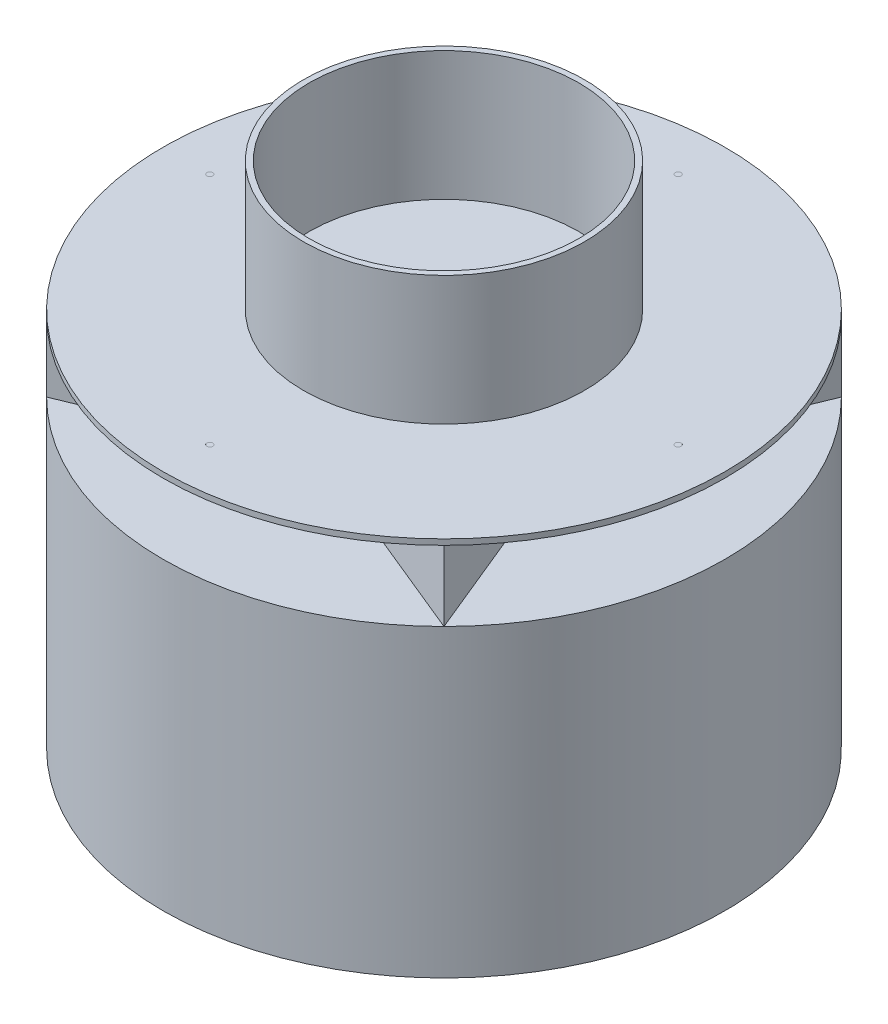
ISO-10303-21;
HEADER;
FILE_DESCRIPTION(('STEP AP214'),'2;1');
FILE_NAME('part.step','',(''),(''),'','','');
FILE_SCHEMA(('AUTOMOTIVE_DESIGN { 1 0 10303 214 1 1 1 1 }'));
ENDSEC;
DATA;
#1=APPLICATION_CONTEXT('core data for automotive mechanical design processes');
#2=APPLICATION_PROTOCOL_DEFINITION('international standard','automotive_design',2000,#1);
#3=PRODUCT_CONTEXT('',#1,'mechanical');
#4=PRODUCT('Part','Part','',(#3));
#5=PRODUCT_RELATED_PRODUCT_CATEGORY('part','',(#4));
#6=PRODUCT_DEFINITION_FORMATION('','',#4);
#7=PRODUCT_DEFINITION_CONTEXT('part definition',#1,'design');
#8=PRODUCT_DEFINITION('design','',#6,#7);
#9=PRODUCT_DEFINITION_SHAPE('','',#8);
#10=(LENGTH_UNIT() NAMED_UNIT(*) SI_UNIT(.MILLI.,.METRE.));
#11=(NAMED_UNIT(*) PLANE_ANGLE_UNIT() SI_UNIT($,.RADIAN.));
#12=(NAMED_UNIT(*) SI_UNIT($,.STERADIAN.) SOLID_ANGLE_UNIT());
#13=UNCERTAINTY_MEASURE_WITH_UNIT(LENGTH_MEASURE(1.E-05),#10,'distance_accuracy_value','');
#14=(GEOMETRIC_REPRESENTATION_CONTEXT(3) GLOBAL_UNCERTAINTY_ASSIGNED_CONTEXT((#13)) GLOBAL_UNIT_ASSIGNED_CONTEXT((#10,
#11,#12)) REPRESENTATION_CONTEXT('',''));
#15=CARTESIAN_POINT('',(0.,0.,0.));
#16=DIRECTION('',(0.,0.,1.));
#17=DIRECTION('',(1.,0.,0.));
#18=AXIS2_PLACEMENT_3D('',#15,#16,#17);
#19=CARTESIAN_POINT('',(0.,330.2,0.));
#20=DIRECTION('',(0.,1.,0.));
#21=DIRECTION('',(0.,0.,1.));
#22=AXIS2_PLACEMENT_3D('',#19,#20,#21);
#23=PLANE('',#22);
#24=CARTESIAN_POINT('',(0.,330.2,0.));
#25=DIRECTION('',(0.,1.,0.));
#26=DIRECTION('',(0.,0.,1.));
#27=AXIS2_PLACEMENT_3D('',#24,#25,#26);
#28=CIRCLE('',#27,304.799999999999);
#29=CARTESIAN_POINT('',(215.526146905657,330.2,215.526146905661));
#30=VERTEX_POINT('',#29);
#31=CARTESIAN_POINT('',(215.526146905657,330.2,-215.526146905661));
#32=VERTEX_POINT('',#31);
#33=EDGE_CURVE('E77',#30,#32,#28,.T.);
#34=ORIENTED_EDGE('',*,*,#33,.T.);
#35=DIRECTION('',(-0.379942648819439,0.,0.925010045139007));
#36=VECTOR('',#35,1.);
#37=CARTESIAN_POINT('',(108.666735118225,330.2,44.6342473753073));
#38=LINE('',#37,#36);
#39=CARTESIAN_POINT('',(127.,330.2,0.));
#40=VERTEX_POINT('',#39);
#41=EDGE_CURVE('E84',#32,#40,#38,.T.);
#42=ORIENTED_EDGE('',*,*,#41,.T.);
#43=DIRECTION('',(0.379942648819439,0.,0.925010045139007));
#44=VECTOR('',#43,1.);
#45=CARTESIAN_POINT('',(127.,330.2,0.));
#46=LINE('',#45,#44);
#47=EDGE_CURVE('E198',#40,#30,#46,.T.);
#48=ORIENTED_EDGE('',*,*,#47,.T.);
#49=EDGE_LOOP('',(#34,#42,#48));
#50=FACE_BOUND('',#49,.T.);
#51=ADVANCED_FACE('F69',(#50),#23,.T.);
#52=DIRECTION('',(0.925010045138999,0.,0.379942648819459));
#53=VECTOR('',#52,1.);
#54=CARTESIAN_POINT('',(0.,330.2,127.));
#55=LINE('',#54,#53);
#56=CARTESIAN_POINT('',(0.,330.2,127.));
#57=VERTEX_POINT('',#56);
#58=EDGE_CURVE('E177',#57,#30,#55,.T.);
#59=ORIENTED_EDGE('',*,*,#58,.F.);
#60=DIRECTION('',(0.925010045138999,0.,-0.379942648819459));
#61=VECTOR('',#60,1.);
#62=CARTESIAN_POINT('',(-215.526146905657,330.2,215.526146905661));
#63=LINE('',#62,#61);
#64=CARTESIAN_POINT('',(-215.526146905657,330.2,215.526146905661));
#65=VERTEX_POINT('',#64);
#66=EDGE_CURVE('E201',#65,#57,#63,.T.);
#67=ORIENTED_EDGE('',*,*,#66,.F.);
#68=EDGE_CURVE('E212',#65,#30,#28,.T.);
#69=ORIENTED_EDGE('',*,*,#68,.T.);
#70=EDGE_LOOP('',(#59,#67,#69));
#71=FACE_BOUND('',#70,.T.);
#72=ADVANCED_FACE('F304',(#71),#23,.T.);
#73=DIRECTION('',(-0.379942648819439,0.,0.925010045139007));
#74=VECTOR('',#73,1.);
#75=CARTESIAN_POINT('',(-127.,330.2,0.));
#76=LINE('',#75,#74);
#77=CARTESIAN_POINT('',(-127.,330.2,0.));
#78=VERTEX_POINT('',#77);
#79=EDGE_CURVE('E203',#78,#65,#76,.T.);
#80=ORIENTED_EDGE('',*,*,#79,.F.);
#81=DIRECTION('',(-0.379942648819439,0.,-0.925010045139007));
#82=VECTOR('',#81,1.);
#83=CARTESIAN_POINT('',(-127.,330.2,0.));
#84=LINE('',#83,#82);
#85=CARTESIAN_POINT('',(-215.526146905657,330.2,-215.526146905661));
#86=VERTEX_POINT('',#85);
#87=EDGE_CURVE('E186',#78,#86,#84,.T.);
#88=ORIENTED_EDGE('',*,*,#87,.T.);
#89=EDGE_CURVE('E218',#86,#65,#28,.T.);
#90=ORIENTED_EDGE('',*,*,#89,.T.);
#91=EDGE_LOOP('',(#80,#88,#90));
#92=FACE_BOUND('',#91,.T.);
#93=ADVANCED_FACE('F311',(#92),#23,.T.);
#94=CARTESIAN_POINT('',(0.,330.2,0.));
#95=DIRECTION('',(0.,-1.,0.));
#96=DIRECTION('',(0.,0.,-1.));
#97=AXIS2_PLACEMENT_3D('',#94,#95,#96);
#98=CYLINDRICAL_SURFACE('',#97,304.799999999999);
#99=ORIENTED_EDGE('',*,*,#33,.F.);
#100=ORIENTED_EDGE('',*,*,#68,.F.);
#101=ORIENTED_EDGE('',*,*,#89,.F.);
#102=EDGE_CURVE('E211',#32,#86,#28,.T.);
#103=ORIENTED_EDGE('',*,*,#102,.F.);
#104=EDGE_LOOP('',(#99,#100,#101,#103));
#105=FACE_BOUND('',#104,.T.);
#106=CARTESIAN_POINT('',(0.,0.,0.));
#107=DIRECTION('',(0.,1.,0.));
#108=DIRECTION('',(0.,0.,1.));
#109=AXIS2_PLACEMENT_3D('',#106,#107,#108);
#110=CIRCLE('',#109,304.799999999999);
#111=CARTESIAN_POINT('',(0.,0.,304.799999999999));
#112=VERTEX_POINT('',#111);
#113=EDGE_CURVE('E213',#112,#112,#110,.T.);
#114=ORIENTED_EDGE('',*,*,#113,.T.);
#115=EDGE_LOOP('',(#114));
#116=FACE_BOUND('',#115,.T.);
#117=ADVANCED_FACE('F71',(#105,#116),#98,.T.);
#118=DIRECTION('',(-0.925010045138999,0.,-0.379942648819459));
#119=VECTOR('',#118,1.);
#120=CARTESIAN_POINT('',(0.,330.2,-127.));
#121=LINE('',#120,#119);
#122=CARTESIAN_POINT('',(0.,330.2,-127.));
#123=VERTEX_POINT('',#122);
#124=EDGE_CURVE('E184',#123,#86,#121,.T.);
#125=ORIENTED_EDGE('',*,*,#124,.F.);
#126=DIRECTION('',(0.925010045138999,0.,-0.379942648819459));
#127=VECTOR('',#126,1.);
#128=CARTESIAN_POINT('',(-44.6342473753093,330.2,-108.666735118223));
#129=LINE('',#128,#127);
#130=EDGE_CURVE('E229',#123,#32,#129,.T.);
#131=ORIENTED_EDGE('',*,*,#130,.T.);
#132=ORIENTED_EDGE('',*,*,#102,.T.);
#133=EDGE_LOOP('',(#125,#131,#132));
#134=FACE_BOUND('',#133,.T.);
#135=ADVANCED_FACE('F307',(#134),#23,.T.);
#136=CARTESIAN_POINT('',(0.,0.,0.));
#137=DIRECTION('',(0.,1.,0.));
#138=DIRECTION('',(0.,0.,1.));
#139=AXIS2_PLACEMENT_3D('',#136,#137,#138);
#140=PLANE('',#139);
#141=ORIENTED_EDGE('',*,*,#113,.F.);
#142=EDGE_LOOP('',(#141));
#143=FACE_BOUND('',#142,.T.);
#144=ADVANCED_FACE('F315',(#143),#140,.F.);
#145=CARTESIAN_POINT('',(108.666735118225,406.4,44.6342473753073));
#146=DIRECTION('',(0.925010045139007,0.,0.379942648819439));
#147=DIRECTION('',(0.379942648819439,0.,-0.925010045139007));
#148=AXIS2_PLACEMENT_3D('',#145,#146,#147);
#149=PLANE('',#148);
#150=ORIENTED_EDGE('',*,*,#41,.F.);
#151=DIRECTION('',(0.,-1.,0.));
#152=VECTOR('',#151,1.);
#153=CARTESIAN_POINT('',(215.526146905657,406.4,-215.526146905661));
#154=LINE('',#153,#152);
#155=CARTESIAN_POINT('',(215.526146905657,406.4,-215.526146905661));
#156=VERTEX_POINT('',#155);
#157=EDGE_CURVE('E222',#156,#32,#154,.T.);
#158=ORIENTED_EDGE('',*,*,#157,.F.);
#159=DIRECTION('',(-0.379942648819439,0.,0.925010045139007));
#160=VECTOR('',#159,1.);
#161=CARTESIAN_POINT('',(108.666735118225,406.4,44.6342473753073));
#162=LINE('',#161,#160);
#163=CARTESIAN_POINT('',(127.,406.4,0.));
#164=VERTEX_POINT('',#163);
#165=EDGE_CURVE('E170',#156,#164,#162,.T.);
#166=ORIENTED_EDGE('',*,*,#165,.T.);
#167=DIRECTION('',(0.,-1.,0.));
#168=VECTOR('',#167,1.);
#169=CARTESIAN_POINT('',(127.,406.4,0.));
#170=LINE('',#169,#168);
#171=EDGE_CURVE('E119',#164,#40,#170,.T.);
#172=ORIENTED_EDGE('',*,*,#171,.T.);
#173=EDGE_LOOP('',(#150,#158,#166,#172));
#174=FACE_BOUND('',#173,.T.);
#175=ADVANCED_FACE('F321',(#174),#149,.T.);
#176=CARTESIAN_POINT('',(-44.6342473753093,406.4,-108.666735118223));
#177=DIRECTION('',(-0.379942648819459,0.,-0.925010045138999));
#178=DIRECTION('',(-0.925010045138999,0.,0.379942648819459));
#179=AXIS2_PLACEMENT_3D('',#176,#177,#178);
#180=PLANE('',#179);
#181=ORIENTED_EDGE('',*,*,#130,.F.);
#182=DIRECTION('',(0.,-1.,0.));
#183=VECTOR('',#182,1.);
#184=CARTESIAN_POINT('',(0.,406.4,-127.));
#185=LINE('',#184,#183);
#186=CARTESIAN_POINT('',(0.,406.4,-127.));
#187=VERTEX_POINT('',#186);
#188=EDGE_CURVE('E226',#187,#123,#185,.T.);
#189=ORIENTED_EDGE('',*,*,#188,.F.);
#190=DIRECTION('',(0.925010045138999,0.,-0.379942648819459));
#191=VECTOR('',#190,1.);
#192=CARTESIAN_POINT('',(-44.6342473753093,406.4,-108.666735118223));
#193=LINE('',#192,#191);
#194=EDGE_CURVE('E228',#187,#156,#193,.T.);
#195=ORIENTED_EDGE('',*,*,#194,.T.);
#196=ORIENTED_EDGE('',*,*,#157,.T.);
#197=EDGE_LOOP('',(#181,#189,#195,#196));
#198=FACE_BOUND('',#197,.T.);
#199=ADVANCED_FACE('F343',(#198),#180,.T.);
#200=CARTESIAN_POINT('',(-127.,406.4,0.));
#201=DIRECTION('',(-0.925010045139007,0.,0.379942648819439));
#202=DIRECTION('',(0.379942648819439,0.,0.925010045139007));
#203=AXIS2_PLACEMENT_3D('',#200,#201,#202);
#204=PLANE('',#203);
#205=ORIENTED_EDGE('',*,*,#87,.F.);
#206=DIRECTION('',(0.,-1.,0.));
#207=VECTOR('',#206,1.);
#208=CARTESIAN_POINT('',(-127.,406.4,0.));
#209=LINE('',#208,#207);
#210=CARTESIAN_POINT('',(-127.,406.4,0.));
#211=VERTEX_POINT('',#210);
#212=EDGE_CURVE('E189',#211,#78,#209,.T.);
#213=ORIENTED_EDGE('',*,*,#212,.F.);
#214=DIRECTION('',(-0.379942648819439,0.,-0.925010045139007));
#215=VECTOR('',#214,1.);
#216=CARTESIAN_POINT('',(-127.,406.4,0.));
#217=LINE('',#216,#215);
#218=CARTESIAN_POINT('',(-215.526146905657,406.4,-215.526146905661));
#219=VERTEX_POINT('',#218);
#220=EDGE_CURVE('E195',#211,#219,#217,.T.);
#221=ORIENTED_EDGE('',*,*,#220,.T.);
#222=DIRECTION('',(0.,-1.,0.));
#223=VECTOR('',#222,1.);
#224=CARTESIAN_POINT('',(-215.526146905657,406.4,-215.526146905661));
#225=LINE('',#224,#223);
#226=EDGE_CURVE('E113',#219,#86,#225,.T.);
#227=ORIENTED_EDGE('',*,*,#226,.T.);
#228=EDGE_LOOP('',(#205,#213,#221,#227));
#229=FACE_BOUND('',#228,.T.);
#230=ADVANCED_FACE('F350',(#229),#204,.T.);
#231=CARTESIAN_POINT('',(0.,406.4,-127.));
#232=DIRECTION('',(-0.379942648819459,0.,0.925010045138999));
#233=DIRECTION('',(0.925010045138999,0.,0.379942648819459));
#234=AXIS2_PLACEMENT_3D('',#231,#232,#233);
#235=PLANE('',#234);
#236=ORIENTED_EDGE('',*,*,#124,.T.);
#237=ORIENTED_EDGE('',*,*,#226,.F.);
#238=DIRECTION('',(-0.925010045138999,0.,-0.379942648819459));
#239=VECTOR('',#238,1.);
#240=CARTESIAN_POINT('',(0.,406.4,-127.));
#241=LINE('',#240,#239);
#242=EDGE_CURVE('E181',#187,#219,#241,.T.);
#243=ORIENTED_EDGE('',*,*,#242,.F.);
#244=ORIENTED_EDGE('',*,*,#188,.T.);
#245=EDGE_LOOP('',(#236,#237,#243,#244));
#246=FACE_BOUND('',#245,.T.);
#247=ADVANCED_FACE('F352',(#246),#235,.F.);
#248=CARTESIAN_POINT('',(0.,406.4,127.));
#249=DIRECTION('',(0.379942648819459,0.,-0.925010045138999));
#250=DIRECTION('',(-0.925010045138999,0.,-0.379942648819459));
#251=AXIS2_PLACEMENT_3D('',#248,#249,#250);
#252=PLANE('',#251);
#253=ORIENTED_EDGE('',*,*,#58,.T.);
#254=DIRECTION('',(0.,-1.,0.));
#255=VECTOR('',#254,1.);
#256=CARTESIAN_POINT('',(215.526146905657,406.4,215.526146905661));
#257=LINE('',#256,#255);
#258=CARTESIAN_POINT('',(215.526146905657,406.4,215.526146905661));
#259=VERTEX_POINT('',#258);
#260=EDGE_CURVE('E174',#259,#30,#257,.T.);
#261=ORIENTED_EDGE('',*,*,#260,.F.);
#262=DIRECTION('',(0.925010045138999,0.,0.379942648819459));
#263=VECTOR('',#262,1.);
#264=CARTESIAN_POINT('',(0.,406.4,127.));
#265=LINE('',#264,#263);
#266=CARTESIAN_POINT('',(0.,406.4,127.));
#267=VERTEX_POINT('',#266);
#268=EDGE_CURVE('E146',#267,#259,#265,.T.);
#269=ORIENTED_EDGE('',*,*,#268,.F.);
#270=DIRECTION('',(0.,-1.,0.));
#271=VECTOR('',#270,1.);
#272=CARTESIAN_POINT('',(0.,406.4,127.));
#273=LINE('',#272,#271);
#274=EDGE_CURVE('E93',#267,#57,#273,.T.);
#275=ORIENTED_EDGE('',*,*,#274,.T.);
#276=EDGE_LOOP('',(#253,#261,#269,#275));
#277=FACE_BOUND('',#276,.T.);
#278=ADVANCED_FACE('F175',(#277),#252,.F.);
#279=CARTESIAN_POINT('',(127.,406.4,0.));
#280=DIRECTION('',(0.925010045139007,0.,-0.379942648819439));
#281=DIRECTION('',(-0.379942648819439,0.,-0.925010045139007));
#282=AXIS2_PLACEMENT_3D('',#279,#280,#281);
#283=PLANE('',#282);
#284=ORIENTED_EDGE('',*,*,#47,.F.);
#285=ORIENTED_EDGE('',*,*,#171,.F.);
#286=DIRECTION('',(0.379942648819439,0.,0.925010045139007));
#287=VECTOR('',#286,1.);
#288=CARTESIAN_POINT('',(127.,406.4,0.));
#289=LINE('',#288,#287);
#290=EDGE_CURVE('E154',#164,#259,#289,.T.);
#291=ORIENTED_EDGE('',*,*,#290,.T.);
#292=ORIENTED_EDGE('',*,*,#260,.T.);
#293=EDGE_LOOP('',(#284,#285,#291,#292));
#294=FACE_BOUND('',#293,.T.);
#295=ADVANCED_FACE('F183',(#294),#283,.T.);
#296=CARTESIAN_POINT('',(-127.,406.4,0.));
#297=DIRECTION('',(0.925010045139007,0.,0.379942648819439));
#298=DIRECTION('',(0.379942648819439,0.,-0.925010045139007));
#299=AXIS2_PLACEMENT_3D('',#296,#297,#298);
#300=PLANE('',#299);
#301=ORIENTED_EDGE('',*,*,#79,.T.);
#302=DIRECTION('',(0.,-1.,0.));
#303=VECTOR('',#302,1.);
#304=CARTESIAN_POINT('',(-215.526146905657,406.4,215.526146905661));
#305=LINE('',#304,#303);
#306=CARTESIAN_POINT('',(-215.526146905657,406.4,215.526146905661));
#307=VERTEX_POINT('',#306);
#308=EDGE_CURVE('E180',#307,#65,#305,.T.);
#309=ORIENTED_EDGE('',*,*,#308,.F.);
#310=DIRECTION('',(-0.379942648819439,0.,0.925010045139007));
#311=VECTOR('',#310,1.);
#312=CARTESIAN_POINT('',(-127.,406.4,0.));
#313=LINE('',#312,#311);
#314=EDGE_CURVE('E193',#211,#307,#313,.T.);
#315=ORIENTED_EDGE('',*,*,#314,.F.);
#316=ORIENTED_EDGE('',*,*,#212,.T.);
#317=EDGE_LOOP('',(#301,#309,#315,#316));
#318=FACE_BOUND('',#317,.T.);
#319=ADVANCED_FACE('F332',(#318),#300,.F.);
#320=CARTESIAN_POINT('',(-215.526146905657,406.4,215.526146905661));
#321=DIRECTION('',(-0.379942648819459,0.,-0.925010045138999));
#322=DIRECTION('',(-0.925010045138999,0.,0.379942648819459));
#323=AXIS2_PLACEMENT_3D('',#320,#321,#322);
#324=PLANE('',#323);
#325=ORIENTED_EDGE('',*,*,#66,.T.);
#326=ORIENTED_EDGE('',*,*,#274,.F.);
#327=DIRECTION('',(0.925010045138999,0.,-0.379942648819459));
#328=VECTOR('',#327,1.);
#329=CARTESIAN_POINT('',(-215.526146905657,406.4,215.526146905661));
#330=LINE('',#329,#328);
#331=EDGE_CURVE('E152',#307,#267,#330,.T.);
#332=ORIENTED_EDGE('',*,*,#331,.F.);
#333=ORIENTED_EDGE('',*,*,#308,.T.);
#334=EDGE_LOOP('',(#325,#326,#332,#333));
#335=FACE_BOUND('',#334,.T.);
#336=ADVANCED_FACE('F335',(#335),#324,.F.);
#337=CARTESIAN_POINT('',(0.,406.4,0.));
#338=DIRECTION('',(0.,1.,0.));
#339=DIRECTION('',(0.,0.,1.));
#340=AXIS2_PLACEMENT_3D('',#337,#338,#339);
#341=PLANE('',#340);
#342=ORIENTED_EDGE('',*,*,#194,.F.);
#343=ORIENTED_EDGE('',*,*,#242,.T.);
#344=CARTESIAN_POINT('',(0.,406.4,0.));
#345=DIRECTION('',(0.,1.,0.));
#346=DIRECTION('',(0.,0.,1.));
#347=AXIS2_PLACEMENT_3D('',#344,#345,#346);
#348=CIRCLE('',#347,304.799999999999);
#349=EDGE_CURVE('E173',#156,#219,#348,.T.);
#350=ORIENTED_EDGE('',*,*,#349,.F.);
#351=EDGE_LOOP('',(#342,#343,#350));
#352=FACE_BOUND('',#351,.T.);
#353=ADVANCED_FACE('F362',(#352),#341,.F.);
#354=ORIENTED_EDGE('',*,*,#220,.F.);
#355=ORIENTED_EDGE('',*,*,#314,.T.);
#356=EDGE_CURVE('E163',#219,#307,#348,.T.);
#357=ORIENTED_EDGE('',*,*,#356,.F.);
#358=EDGE_LOOP('',(#354,#355,#357));
#359=FACE_BOUND('',#358,.T.);
#360=ADVANCED_FACE('F300',(#359),#341,.F.);
#361=ORIENTED_EDGE('',*,*,#290,.F.);
#362=ORIENTED_EDGE('',*,*,#165,.F.);
#363=EDGE_CURVE('E161',#259,#156,#348,.T.);
#364=ORIENTED_EDGE('',*,*,#363,.F.);
#365=EDGE_LOOP('',(#361,#362,#364));
#366=FACE_BOUND('',#365,.T.);
#367=ADVANCED_FACE('F168',(#366),#341,.F.);
#368=CARTESIAN_POINT('',(0.,412.496,0.));
#369=DIRECTION('',(0.,-1.,0.));
#370=DIRECTION('',(0.,0.,-1.));
#371=AXIS2_PLACEMENT_3D('',#368,#369,#370);
#372=CYLINDRICAL_SURFACE('',#371,304.799999999999);
#373=CARTESIAN_POINT('',(0.,412.496,0.));
#374=DIRECTION('',(0.,1.,0.));
#375=DIRECTION('',(0.,0.,1.));
#376=AXIS2_PLACEMENT_3D('',#373,#374,#375);
#377=CIRCLE('',#376,304.799999999999);
#378=CARTESIAN_POINT('',(0.,412.496,304.799999999999));
#379=VERTEX_POINT('',#378);
#380=EDGE_CURVE('E172',#379,#379,#377,.T.);
#381=ORIENTED_EDGE('',*,*,#380,.F.);
#382=EDGE_LOOP('',(#381));
#383=FACE_BOUND('',#382,.T.);
#384=ORIENTED_EDGE('',*,*,#363,.T.);
#385=ORIENTED_EDGE('',*,*,#349,.T.);
#386=ORIENTED_EDGE('',*,*,#356,.T.);
#387=EDGE_CURVE('E149',#307,#259,#348,.T.);
#388=ORIENTED_EDGE('',*,*,#387,.T.);
#389=EDGE_LOOP('',(#384,#385,#386,#388));
#390=FACE_BOUND('',#389,.T.);
#391=ADVANCED_FACE('F159',(#383,#390),#372,.T.);
#392=CARTESIAN_POINT('',(0.,412.496,0.));
#393=DIRECTION('',(0.,1.,0.));
#394=DIRECTION('',(0.,0.,1.));
#395=AXIS2_PLACEMENT_3D('',#392,#393,#394);
#396=PLANE('',#395);
#397=CARTESIAN_POINT('',(0.,412.496,-254.));
#398=DIRECTION('',(0.,1.,0.));
#399=DIRECTION('',(0.,0.,1.));
#400=AXIS2_PLACEMENT_3D('',#397,#398,#399);
#401=CIRCLE('',#400,3.175);
#402=CARTESIAN_POINT('',(0.,412.496,-250.825));
#403=VERTEX_POINT('',#402);
#404=EDGE_CURVE('E265',#403,#403,#401,.T.);
#405=ORIENTED_EDGE('',*,*,#404,.F.);
#406=EDGE_LOOP('',(#405));
#407=FACE_BOUND('',#406,.T.);
#408=CARTESIAN_POINT('',(0.,412.496,254.));
#409=DIRECTION('',(0.,1.,0.));
#410=DIRECTION('',(0.,0.,1.));
#411=AXIS2_PLACEMENT_3D('',#408,#409,#410);
#412=CIRCLE('',#411,3.175);
#413=CARTESIAN_POINT('',(0.,412.496,257.175));
#414=VERTEX_POINT('',#413);
#415=EDGE_CURVE('E259',#414,#414,#412,.T.);
#416=ORIENTED_EDGE('',*,*,#415,.F.);
#417=EDGE_LOOP('',(#416));
#418=FACE_BOUND('',#417,.T.);
#419=CARTESIAN_POINT('',(-254.,412.496,0.));
#420=DIRECTION('',(0.,1.,0.));
#421=DIRECTION('',(0.,0.,1.));
#422=AXIS2_PLACEMENT_3D('',#419,#420,#421);
#423=CIRCLE('',#422,3.17499999999997);
#424=CARTESIAN_POINT('',(-254.,412.496,3.17499999999997));
#425=VERTEX_POINT('',#424);
#426=EDGE_CURVE('E253',#425,#425,#423,.T.);
#427=ORIENTED_EDGE('',*,*,#426,.F.);
#428=EDGE_LOOP('',(#427));
#429=FACE_BOUND('',#428,.T.);
#430=CARTESIAN_POINT('',(254.,412.496,0.));
#431=DIRECTION('',(0.,1.,0.));
#432=DIRECTION('',(0.,0.,1.));
#433=AXIS2_PLACEMENT_3D('',#430,#431,#432);
#434=CIRCLE('',#433,3.17499999999997);
#435=CARTESIAN_POINT('',(254.,412.496,3.17499999999997));
#436=VERTEX_POINT('',#435);
#437=EDGE_CURVE('E247',#436,#436,#434,.T.);
#438=ORIENTED_EDGE('',*,*,#437,.F.);
#439=EDGE_LOOP('',(#438));
#440=FACE_BOUND('',#439,.T.);
#441=CARTESIAN_POINT('',(0.,412.496,0.));
#442=DIRECTION('',(0.,1.,0.));
#443=DIRECTION('',(0.,0.,1.));
#444=AXIS2_PLACEMENT_3D('',#441,#442,#443);
#445=CIRCLE('',#444,152.4);
#446=CARTESIAN_POINT('',(0.,412.496,152.4));
#447=VERTEX_POINT('',#446);
#448=EDGE_CURVE('E238',#447,#447,#445,.T.);
#449=ORIENTED_EDGE('',*,*,#448,.F.);
#450=EDGE_LOOP('',(#449));
#451=FACE_BOUND('',#450,.T.);
#452=ORIENTED_EDGE('',*,*,#380,.T.);
#453=EDGE_LOOP('',(#452));
#454=FACE_BOUND('',#453,.T.);
#455=ADVANCED_FACE('F280',(#407,#418,#429,#440,#451,#454),#396,.T.);
#456=ORIENTED_EDGE('',*,*,#387,.F.);
#457=ORIENTED_EDGE('',*,*,#331,.T.);
#458=ORIENTED_EDGE('',*,*,#268,.T.);
#459=EDGE_LOOP('',(#456,#457,#458));
#460=FACE_BOUND('',#459,.T.);
#461=ADVANCED_FACE('F148',(#460),#341,.F.);
#462=CARTESIAN_POINT('',(0.,552.196,0.));
#463=DIRECTION('',(0.,1.,0.));
#464=DIRECTION('',(0.,0.,1.));
#465=AXIS2_PLACEMENT_3D('',#462,#463,#464);
#466=PLANE('',#465);
#467=CARTESIAN_POINT('',(0.,552.196,0.));
#468=DIRECTION('',(0.,1.,0.));
#469=DIRECTION('',(0.,0.,1.));
#470=AXIS2_PLACEMENT_3D('',#467,#468,#469);
#471=CIRCLE('',#470,152.4);
#472=CARTESIAN_POINT('',(0.,552.196,152.4));
#473=VERTEX_POINT('',#472);
#474=EDGE_CURVE('E165',#473,#473,#471,.T.);
#475=ORIENTED_EDGE('',*,*,#474,.T.);
#476=EDGE_LOOP('',(#475));
#477=FACE_BOUND('',#476,.T.);
#478=CARTESIAN_POINT('',(0.,552.196,0.));
#479=DIRECTION('',(0.,1.,0.));
#480=DIRECTION('',(0.,0.,1.));
#481=AXIS2_PLACEMENT_3D('',#478,#479,#480);
#482=CIRCLE('',#481,146.304);
#483=CARTESIAN_POINT('',(0.,552.196,146.304));
#484=VERTEX_POINT('',#483);
#485=EDGE_CURVE('E241',#484,#484,#482,.T.);
#486=ORIENTED_EDGE('',*,*,#485,.F.);
#487=EDGE_LOOP('',(#486));
#488=FACE_BOUND('',#487,.T.);
#489=ADVANCED_FACE('F407',(#477,#488),#466,.T.);
#490=CARTESIAN_POINT('',(0.,552.196,0.));
#491=DIRECTION('',(0.,-1.,0.));
#492=DIRECTION('',(0.,0.,-1.));
#493=AXIS2_PLACEMENT_3D('',#490,#491,#492);
#494=CYLINDRICAL_SURFACE('',#493,152.4);
#495=ORIENTED_EDGE('',*,*,#474,.F.);
#496=EDGE_LOOP('',(#495));
#497=FACE_BOUND('',#496,.T.);
#498=ORIENTED_EDGE('',*,*,#448,.T.);
#499=EDGE_LOOP('',(#498));
#500=FACE_BOUND('',#499,.T.);
#501=ADVANCED_FACE('F417',(#497,#500),#494,.T.);
#502=CARTESIAN_POINT('',(0.,552.196,0.));
#503=DIRECTION('',(0.,-1.,0.));
#504=DIRECTION('',(0.,0.,-1.));
#505=AXIS2_PLACEMENT_3D('',#502,#503,#504);
#506=CYLINDRICAL_SURFACE('',#505,146.304);
#507=ORIENTED_EDGE('',*,*,#485,.T.);
#508=EDGE_LOOP('',(#507));
#509=FACE_BOUND('',#508,.T.);
#510=CARTESIAN_POINT('',(0.,412.496,0.));
#511=DIRECTION('',(0.,1.,0.));
#512=DIRECTION('',(0.,0.,1.));
#513=AXIS2_PLACEMENT_3D('',#510,#511,#512);
#514=CIRCLE('',#513,146.304);
#515=CARTESIAN_POINT('',(0.,412.496,146.304));
#516=VERTEX_POINT('',#515);
#517=EDGE_CURVE('E12',#516,#516,#514,.F.);
#518=ORIENTED_EDGE('',*,*,#517,.T.);
#519=EDGE_LOOP('',(#518));
#520=FACE_BOUND('',#519,.T.);
#521=ADVANCED_FACE('F428',(#509,#520),#506,.F.);
#522=ORIENTED_EDGE('',*,*,#517,.F.);
#523=EDGE_LOOP('',(#522));
#524=FACE_BOUND('',#523,.T.);
#525=ADVANCED_FACE('F284',(#524),#396,.T.);
#526=CARTESIAN_POINT('',(254.,412.4706,0.));
#527=DIRECTION('',(0.,1.,0.));
#528=DIRECTION('',(0.,0.,1.));
#529=AXIS2_PLACEMENT_3D('',#526,#527,#528);
#530=CYLINDRICAL_SURFACE('',#529,3.17499999999997);
#531=CARTESIAN_POINT('',(254.,412.4706,0.));
#532=DIRECTION('',(0.,1.,0.));
#533=DIRECTION('',(0.,0.,1.));
#534=AXIS2_PLACEMENT_3D('',#531,#532,#533);
#535=CIRCLE('',#534,3.17499999999997);
#536=CARTESIAN_POINT('',(254.,412.4706,3.17499999999997));
#537=VERTEX_POINT('',#536);
#538=EDGE_CURVE('E246',#537,#537,#535,.T.);
#539=ORIENTED_EDGE('',*,*,#538,.F.);
#540=EDGE_LOOP('',(#539));
#541=FACE_BOUND('',#540,.T.);
#542=ORIENTED_EDGE('',*,*,#437,.T.);
#543=EDGE_LOOP('',(#542));
#544=FACE_BOUND('',#543,.T.);
#545=ADVANCED_FACE('F448',(#541,#544),#530,.F.);
#546=CARTESIAN_POINT('',(254.,412.4706,0.));
#547=DIRECTION('',(0.,1.,0.));
#548=DIRECTION('',(0.,0.,1.));
#549=AXIS2_PLACEMENT_3D('',#546,#547,#548);
#550=PLANE('',#549);
#551=ORIENTED_EDGE('',*,*,#538,.T.);
#552=EDGE_LOOP('',(#551));
#553=FACE_BOUND('',#552,.T.);
#554=ADVANCED_FACE('F461',(#553),#550,.T.);
#555=CARTESIAN_POINT('',(-254.,412.4706,0.));
#556=DIRECTION('',(0.,1.,0.));
#557=DIRECTION('',(0.,0.,1.));
#558=AXIS2_PLACEMENT_3D('',#555,#556,#557);
#559=CYLINDRICAL_SURFACE('',#558,3.17499999999997);
#560=CARTESIAN_POINT('',(-254.,412.4706,0.));
#561=DIRECTION('',(0.,1.,0.));
#562=DIRECTION('',(0.,0.,1.));
#563=AXIS2_PLACEMENT_3D('',#560,#561,#562);
#564=CIRCLE('',#563,3.17499999999997);
#565=CARTESIAN_POINT('',(-254.,412.4706,3.17499999999997));
#566=VERTEX_POINT('',#565);
#567=EDGE_CURVE('E256',#566,#566,#564,.T.);
#568=ORIENTED_EDGE('',*,*,#567,.F.);
#569=EDGE_LOOP('',(#568));
#570=FACE_BOUND('',#569,.T.);
#571=ORIENTED_EDGE('',*,*,#426,.T.);
#572=EDGE_LOOP('',(#571));
#573=FACE_BOUND('',#572,.T.);
#574=ADVANCED_FACE('F471',(#570,#573),#559,.F.);
#575=CARTESIAN_POINT('',(-254.,412.4706,0.));
#576=DIRECTION('',(0.,1.,0.));
#577=DIRECTION('',(0.,0.,1.));
#578=AXIS2_PLACEMENT_3D('',#575,#576,#577);
#579=PLANE('',#578);
#580=ORIENTED_EDGE('',*,*,#567,.T.);
#581=EDGE_LOOP('',(#580));
#582=FACE_BOUND('',#581,.T.);
#583=ADVANCED_FACE('F481',(#582),#579,.T.);
#584=CARTESIAN_POINT('',(0.,412.4706,254.));
#585=DIRECTION('',(0.,1.,0.));
#586=DIRECTION('',(0.,0.,1.));
#587=AXIS2_PLACEMENT_3D('',#584,#585,#586);
#588=CYLINDRICAL_SURFACE('',#587,3.175);
#589=CARTESIAN_POINT('',(0.,412.4706,254.));
#590=DIRECTION('',(0.,1.,0.));
#591=DIRECTION('',(0.,0.,1.));
#592=AXIS2_PLACEMENT_3D('',#589,#590,#591);
#593=CIRCLE('',#592,3.175);
#594=CARTESIAN_POINT('',(0.,412.4706,257.175));
#595=VERTEX_POINT('',#594);
#596=EDGE_CURVE('E262',#595,#595,#593,.T.);
#597=ORIENTED_EDGE('',*,*,#596,.F.);
#598=EDGE_LOOP('',(#597));
#599=FACE_BOUND('',#598,.T.);
#600=ORIENTED_EDGE('',*,*,#415,.T.);
#601=EDGE_LOOP('',(#600));
#602=FACE_BOUND('',#601,.T.);
#603=ADVANCED_FACE('F491',(#599,#602),#588,.F.);
#604=CARTESIAN_POINT('',(0.,412.4706,254.));
#605=DIRECTION('',(0.,1.,0.));
#606=DIRECTION('',(0.,0.,1.));
#607=AXIS2_PLACEMENT_3D('',#604,#605,#606);
#608=PLANE('',#607);
#609=ORIENTED_EDGE('',*,*,#596,.T.);
#610=EDGE_LOOP('',(#609));
#611=FACE_BOUND('',#610,.T.);
#612=ADVANCED_FACE('F276',(#611),#608,.T.);
#613=CARTESIAN_POINT('',(0.,412.4706,-254.));
#614=DIRECTION('',(0.,1.,0.));
#615=DIRECTION('',(0.,0.,1.));
#616=AXIS2_PLACEMENT_3D('',#613,#614,#615);
#617=CYLINDRICAL_SURFACE('',#616,3.175);
#618=CARTESIAN_POINT('',(0.,412.4706,-254.));
#619=DIRECTION('',(0.,1.,0.));
#620=DIRECTION('',(0.,0.,1.));
#621=AXIS2_PLACEMENT_3D('',#618,#619,#620);
#622=CIRCLE('',#621,3.175);
#623=CARTESIAN_POINT('',(0.,412.4706,-250.825));
#624=VERTEX_POINT('',#623);
#625=EDGE_CURVE('E250',#624,#624,#622,.T.);
#626=ORIENTED_EDGE('',*,*,#625,.F.);
#627=EDGE_LOOP('',(#626));
#628=FACE_BOUND('',#627,.T.);
#629=ORIENTED_EDGE('',*,*,#404,.T.);
#630=EDGE_LOOP('',(#629));
#631=FACE_BOUND('',#630,.T.);
#632=ADVANCED_FACE('F273',(#628,#631),#617,.F.);
#633=CARTESIAN_POINT('',(0.,412.4706,-254.));
#634=DIRECTION('',(0.,1.,0.));
#635=DIRECTION('',(0.,0.,1.));
#636=AXIS2_PLACEMENT_3D('',#633,#634,#635);
#637=PLANE('',#636);
#638=ORIENTED_EDGE('',*,*,#625,.T.);
#639=EDGE_LOOP('',(#638));
#640=FACE_BOUND('',#639,.T.);
#641=ADVANCED_FACE('F271',(#640),#637,.T.);
#642=CLOSED_SHELL('',(#51,#72,#93,#117,#135,#144,#175,#199,#230,#247,#278,#295,#319,#336,#353,
#360,#367,#391,#455,#461,#489,#501,#521,#525,#545,#554,#574,#583,#603,#612,#632,#641));
#643=MANIFOLD_SOLID_BREP('B2',#642);
#644=ADVANCED_BREP_SHAPE_REPRESENTATION('',(#18,#643),#14);
#645=SHAPE_DEFINITION_REPRESENTATION(#9,#644);
ENDSEC;
END-ISO-10303-21;
